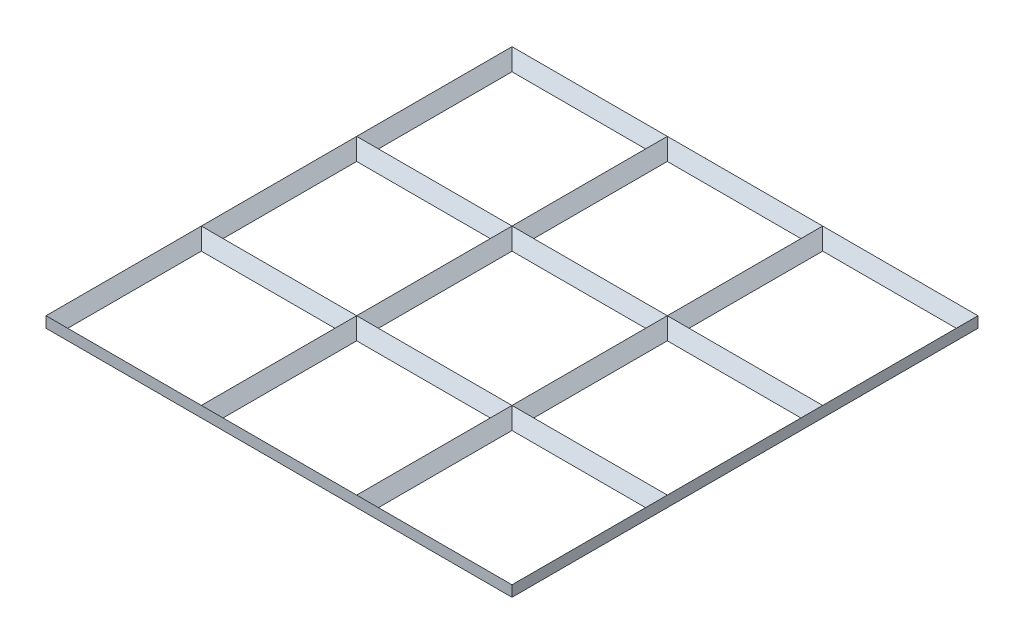
ISO-10303-21;
HEADER;
FILE_DESCRIPTION(('STEP AP214'),'2;1');
FILE_NAME('part.step','',(''),(''),'','','');
FILE_SCHEMA(('AUTOMOTIVE_DESIGN { 1 0 10303 214 1 1 1 1 }'));
ENDSEC;
DATA;
#1=APPLICATION_CONTEXT('core data for automotive mechanical design processes');
#2=APPLICATION_PROTOCOL_DEFINITION('international standard','automotive_design',2000,#1);
#3=PRODUCT_CONTEXT('',#1,'mechanical');
#4=PRODUCT('Part','Part','',(#3));
#5=PRODUCT_RELATED_PRODUCT_CATEGORY('part','',(#4));
#6=PRODUCT_DEFINITION_FORMATION('','',#4);
#7=PRODUCT_DEFINITION_CONTEXT('part definition',#1,'design');
#8=PRODUCT_DEFINITION('design','',#6,#7);
#9=PRODUCT_DEFINITION_SHAPE('','',#8);
#10=(LENGTH_UNIT() NAMED_UNIT(*) SI_UNIT(.MILLI.,.METRE.));
#11=(NAMED_UNIT(*) PLANE_ANGLE_UNIT() SI_UNIT($,.RADIAN.));
#12=(NAMED_UNIT(*) SI_UNIT($,.STERADIAN.) SOLID_ANGLE_UNIT());
#13=UNCERTAINTY_MEASURE_WITH_UNIT(LENGTH_MEASURE(1.E-05),#10,'distance_accuracy_value','');
#14=(GEOMETRIC_REPRESENTATION_CONTEXT(3) GLOBAL_UNCERTAINTY_ASSIGNED_CONTEXT((#13)) GLOBAL_UNIT_ASSIGNED_CONTEXT((#10,
#11,#12)) REPRESENTATION_CONTEXT('',''));
#15=CARTESIAN_POINT('',(0.,0.,0.));
#16=DIRECTION('',(0.,0.,1.));
#17=DIRECTION('',(1.,0.,0.));
#18=AXIS2_PLACEMENT_3D('',#15,#16,#17);
#19=CARTESIAN_POINT('',(0.,3.5,100.));
#20=DIRECTION('',(-1.,0.,0.));
#21=DIRECTION('',(0.,0.,1.));
#22=AXIS2_PLACEMENT_3D('',#19,#20,#21);
#23=PLANE('',#22);
#24=DIRECTION('',(0.,0.,-1.));
#25=VECTOR('',#24,1.);
#26=CARTESIAN_POINT('',(0.,0.,100.));
#27=LINE('',#26,#25);
#28=CARTESIAN_POINT('',(0.,0.,100.));
#29=VERTEX_POINT('',#28);
#30=CARTESIAN_POINT('',(0.,0.,-50.));
#31=VERTEX_POINT('',#30);
#32=EDGE_CURVE('E228',#29,#31,#27,.T.);
#33=ORIENTED_EDGE('',*,*,#32,.F.);
#34=DIRECTION('',(0.,-1.,0.));
#35=VECTOR('',#34,1.);
#36=CARTESIAN_POINT('',(0.,3.5,100.));
#37=LINE('',#36,#35);
#38=CARTESIAN_POINT('',(0.,3.5,100.));
#39=VERTEX_POINT('',#38);
#40=EDGE_CURVE('E11',#39,#29,#37,.T.);
#41=ORIENTED_EDGE('',*,*,#40,.F.);
#42=DIRECTION('',(0.,0.,-1.));
#43=VECTOR('',#42,1.);
#44=CARTESIAN_POINT('',(0.,3.5,100.));
#45=LINE('',#44,#43);
#46=CARTESIAN_POINT('',(0.,3.5,50.));
#47=VERTEX_POINT('',#46);
#48=EDGE_CURVE('E479',#39,#47,#45,.T.);
#49=ORIENTED_EDGE('',*,*,#48,.T.);
#50=DIRECTION('',(0.,0.,-1.));
#51=VECTOR('',#50,1.);
#52=CARTESIAN_POINT('',(0.,3.5,50.));
#53=LINE('',#52,#51);
#54=CARTESIAN_POINT('',(0.,3.5,0.));
#55=VERTEX_POINT('',#54);
#56=EDGE_CURVE('E327',#47,#55,#53,.T.);
#57=ORIENTED_EDGE('',*,*,#56,.T.);
#58=DIRECTION('',(0.,0.,-1.));
#59=VECTOR('',#58,1.);
#60=CARTESIAN_POINT('',(0.,3.5,0.));
#61=LINE('',#60,#59);
#62=CARTESIAN_POINT('',(0.,3.5,-50.));
#63=VERTEX_POINT('',#62);
#64=EDGE_CURVE('E308',#55,#63,#61,.T.);
#65=ORIENTED_EDGE('',*,*,#64,.T.);
#66=DIRECTION('',(0.,-1.,0.));
#67=VECTOR('',#66,1.);
#68=CARTESIAN_POINT('',(0.,3.5,-50.));
#69=LINE('',#68,#67);
#70=EDGE_CURVE('E305',#63,#31,#69,.T.);
#71=ORIENTED_EDGE('',*,*,#70,.T.);
#72=EDGE_LOOP('',(#33,#41,#49,#57,#65,#71));
#73=FACE_BOUND('',#72,.T.);
#74=ADVANCED_FACE('F38',(#73),#23,.T.);
#75=CARTESIAN_POINT('',(0.,3.5,100.));
#76=DIRECTION('',(0.,0.,-1.));
#77=DIRECTION('',(-1.,0.,0.));
#78=AXIS2_PLACEMENT_3D('',#75,#76,#77);
#79=PLANE('',#78);
#80=DIRECTION('',(1.,0.,0.));
#81=VECTOR('',#80,1.);
#82=CARTESIAN_POINT('',(0.,0.,100.));
#83=LINE('',#82,#81);
#84=CARTESIAN_POINT('',(150.,0.,100.));
#85=VERTEX_POINT('',#84);
#86=EDGE_CURVE('E482',#29,#85,#83,.T.);
#87=ORIENTED_EDGE('',*,*,#86,.T.);
#88=DIRECTION('',(0.,-1.,0.));
#89=VECTOR('',#88,1.);
#90=CARTESIAN_POINT('',(150.,3.5,100.));
#91=LINE('',#90,#89);
#92=CARTESIAN_POINT('',(150.,3.5,100.));
#93=VERTEX_POINT('',#92);
#94=EDGE_CURVE('E244',#93,#85,#91,.T.);
#95=ORIENTED_EDGE('',*,*,#94,.F.);
#96=DIRECTION('',(1.,0.,0.));
#97=VECTOR('',#96,1.);
#98=CARTESIAN_POINT('',(100.,3.5,100.));
#99=LINE('',#98,#97);
#100=CARTESIAN_POINT('',(100.,3.5,100.));
#101=VERTEX_POINT('',#100);
#102=EDGE_CURVE('E369',#101,#93,#99,.T.);
#103=ORIENTED_EDGE('',*,*,#102,.F.);
#104=DIRECTION('',(1.,0.,0.));
#105=VECTOR('',#104,1.);
#106=CARTESIAN_POINT('',(50.,3.5,100.));
#107=LINE('',#106,#105);
#108=CARTESIAN_POINT('',(50.,3.5,100.));
#109=VERTEX_POINT('',#108);
#110=EDGE_CURVE('E430',#109,#101,#107,.T.);
#111=ORIENTED_EDGE('',*,*,#110,.F.);
#112=DIRECTION('',(1.,0.,0.));
#113=VECTOR('',#112,1.);
#114=CARTESIAN_POINT('',(0.,3.5,100.));
#115=LINE('',#114,#113);
#116=EDGE_CURVE('E45',#39,#109,#115,.T.);
#117=ORIENTED_EDGE('',*,*,#116,.F.);
#118=ORIENTED_EDGE('',*,*,#40,.T.);
#119=EDGE_LOOP('',(#87,#95,#103,#111,#117,#118));
#120=FACE_BOUND('',#119,.T.);
#121=ADVANCED_FACE('F493',(#120),#79,.F.);
#122=CARTESIAN_POINT('',(0.,0.,100.));
#123=DIRECTION('',(0.,1.,0.));
#124=DIRECTION('',(0.,0.,1.));
#125=AXIS2_PLACEMENT_3D('',#122,#123,#124);
#126=PLANE('',#125);
#127=DIRECTION('',(1.,0.,0.));
#128=VECTOR('',#127,1.);
#129=CARTESIAN_POINT('',(0.,0.,96.5));
#130=LINE('',#129,#128);
#131=CARTESIAN_POINT('',(3.5,0.,96.5));
#132=VERTEX_POINT('',#131);
#133=CARTESIAN_POINT('',(46.5,0.,96.5));
#134=VERTEX_POINT('',#133);
#135=EDGE_CURVE('E473',#132,#134,#130,.T.);
#136=ORIENTED_EDGE('',*,*,#135,.T.);
#137=DIRECTION('',(0.,0.,1.));
#138=VECTOR('',#137,1.);
#139=CARTESIAN_POINT('',(46.5,0.,100.));
#140=LINE('',#139,#138);
#141=CARTESIAN_POINT('',(46.5,0.,53.5));
#142=VERTEX_POINT('',#141);
#143=EDGE_CURVE('E490',#142,#134,#140,.T.);
#144=ORIENTED_EDGE('',*,*,#143,.F.);
#145=DIRECTION('',(1.,0.,0.));
#146=VECTOR('',#145,1.);
#147=CARTESIAN_POINT('',(0.,0.,53.5));
#148=LINE('',#147,#146);
#149=CARTESIAN_POINT('',(3.5,0.,53.5));
#150=VERTEX_POINT('',#149);
#151=EDGE_CURVE('E487',#150,#142,#148,.T.);
#152=ORIENTED_EDGE('',*,*,#151,.F.);
#153=DIRECTION('',(0.,0.,-1.));
#154=VECTOR('',#153,1.);
#155=CARTESIAN_POINT('',(3.5,0.,100.));
#156=LINE('',#155,#154);
#157=EDGE_CURVE('E58',#132,#150,#156,.T.);
#158=ORIENTED_EDGE('',*,*,#157,.F.);
#159=EDGE_LOOP('',(#136,#144,#152,#158));
#160=FACE_BOUND('',#159,.T.);
#161=DIRECTION('',(0.,0.,1.));
#162=VECTOR('',#161,1.);
#163=CARTESIAN_POINT('',(150.,0.,50.));
#164=LINE('',#163,#162);
#165=CARTESIAN_POINT('',(150.,0.,-50.));
#166=VERTEX_POINT('',#165);
#167=EDGE_CURVE('E225',#166,#85,#164,.T.);
#168=ORIENTED_EDGE('',*,*,#167,.T.);
#169=ORIENTED_EDGE('',*,*,#86,.F.);
#170=ORIENTED_EDGE('',*,*,#32,.T.);
#171=DIRECTION('',(1.,0.,0.));
#172=VECTOR('',#171,1.);
#173=CARTESIAN_POINT('',(50.,0.,-50.));
#174=LINE('',#173,#172);
#175=EDGE_CURVE('E221',#31,#166,#174,.T.);
#176=ORIENTED_EDGE('',*,*,#175,.T.);
#177=EDGE_LOOP('',(#168,#169,#170,#176));
#178=FACE_BOUND('',#177,.T.);
#179=DIRECTION('',(1.,0.,0.));
#180=VECTOR('',#179,1.);
#181=CARTESIAN_POINT('',(50.,0.,-3.5));
#182=LINE('',#181,#180);
#183=CARTESIAN_POINT('',(53.5,0.,-3.5));
#184=VERTEX_POINT('',#183);
#185=CARTESIAN_POINT('',(96.5,0.,-3.5));
#186=VERTEX_POINT('',#185);
#187=EDGE_CURVE('E445',#184,#186,#182,.T.);
#188=ORIENTED_EDGE('',*,*,#187,.T.);
#189=DIRECTION('',(0.,0.,1.));
#190=VECTOR('',#189,1.);
#191=CARTESIAN_POINT('',(96.5,0.,0.));
#192=LINE('',#191,#190);
#193=CARTESIAN_POINT('',(96.5,0.,-46.5));
#194=VERTEX_POINT('',#193);
#195=EDGE_CURVE('E234',#194,#186,#192,.T.);
#196=ORIENTED_EDGE('',*,*,#195,.F.);
#197=DIRECTION('',(1.,0.,0.));
#198=VECTOR('',#197,1.);
#199=CARTESIAN_POINT('',(50.,0.,-46.5));
#200=LINE('',#199,#198);
#201=CARTESIAN_POINT('',(53.5,0.,-46.5));
#202=VERTEX_POINT('',#201);
#203=EDGE_CURVE('E466',#202,#194,#200,.T.);
#204=ORIENTED_EDGE('',*,*,#203,.F.);
#205=DIRECTION('',(0.,0.,-1.));
#206=VECTOR('',#205,1.);
#207=CARTESIAN_POINT('',(53.5,0.,0.));
#208=LINE('',#207,#206);
#209=EDGE_CURVE('E464',#184,#202,#208,.T.);
#210=ORIENTED_EDGE('',*,*,#209,.F.);
#211=EDGE_LOOP('',(#188,#196,#204,#210));
#212=FACE_BOUND('',#211,.T.);
#213=DIRECTION('',(1.,0.,0.));
#214=VECTOR('',#213,1.);
#215=CARTESIAN_POINT('',(50.,0.,96.5));
#216=LINE('',#215,#214);
#217=CARTESIAN_POINT('',(53.5,0.,96.5));
#218=VERTEX_POINT('',#217);
#219=CARTESIAN_POINT('',(96.5,0.,96.5));
#220=VERTEX_POINT('',#219);
#221=EDGE_CURVE('E414',#218,#220,#216,.T.);
#222=ORIENTED_EDGE('',*,*,#221,.T.);
#223=DIRECTION('',(0.,0.,1.));
#224=VECTOR('',#223,1.);
#225=CARTESIAN_POINT('',(96.5,0.,100.));
#226=LINE('',#225,#224);
#227=CARTESIAN_POINT('',(96.5,0.,53.5));
#228=VERTEX_POINT('',#227);
#229=EDGE_CURVE('E425',#228,#220,#226,.T.);
#230=ORIENTED_EDGE('',*,*,#229,.F.);
#231=DIRECTION('',(1.,0.,0.));
#232=VECTOR('',#231,1.);
#233=CARTESIAN_POINT('',(50.,0.,53.5));
#234=LINE('',#233,#232);
#235=CARTESIAN_POINT('',(53.5,0.,53.5));
#236=VERTEX_POINT('',#235);
#237=EDGE_CURVE('E438',#236,#228,#234,.T.);
#238=ORIENTED_EDGE('',*,*,#237,.F.);
#239=DIRECTION('',(0.,0.,-1.));
#240=VECTOR('',#239,1.);
#241=CARTESIAN_POINT('',(53.5,0.,100.));
#242=LINE('',#241,#240);
#243=EDGE_CURVE('E436',#218,#236,#242,.T.);
#244=ORIENTED_EDGE('',*,*,#243,.F.);
#245=EDGE_LOOP('',(#222,#230,#238,#244));
#246=FACE_BOUND('',#245,.T.);
#247=DIRECTION('',(1.,0.,0.));
#248=VECTOR('',#247,1.);
#249=CARTESIAN_POINT('',(100.,0.,46.5));
#250=LINE('',#249,#248);
#251=CARTESIAN_POINT('',(103.5,0.,46.5));
#252=VERTEX_POINT('',#251);
#253=CARTESIAN_POINT('',(146.5,0.,46.5));
#254=VERTEX_POINT('',#253);
#255=EDGE_CURVE('E385',#252,#254,#250,.T.);
#256=ORIENTED_EDGE('',*,*,#255,.T.);
#257=DIRECTION('',(0.,0.,1.));
#258=VECTOR('',#257,1.);
#259=CARTESIAN_POINT('',(146.5,0.,50.));
#260=LINE('',#259,#258);
#261=CARTESIAN_POINT('',(146.5,0.,3.5));
#262=VERTEX_POINT('',#261);
#263=EDGE_CURVE('E246',#262,#254,#260,.T.);
#264=ORIENTED_EDGE('',*,*,#263,.F.);
#265=DIRECTION('',(1.,0.,0.));
#266=VECTOR('',#265,1.);
#267=CARTESIAN_POINT('',(100.,0.,3.5));
#268=LINE('',#267,#266);
#269=CARTESIAN_POINT('',(103.5,0.,3.5));
#270=VERTEX_POINT('',#269);
#271=EDGE_CURVE('E407',#270,#262,#268,.T.);
#272=ORIENTED_EDGE('',*,*,#271,.F.);
#273=DIRECTION('',(0.,0.,-1.));
#274=VECTOR('',#273,1.);
#275=CARTESIAN_POINT('',(103.5,0.,50.));
#276=LINE('',#275,#274);
#277=EDGE_CURVE('E405',#252,#270,#276,.T.);
#278=ORIENTED_EDGE('',*,*,#277,.F.);
#279=EDGE_LOOP('',(#256,#264,#272,#278));
#280=FACE_BOUND('',#279,.T.);
#281=DIRECTION('',(1.,0.,0.));
#282=VECTOR('',#281,1.);
#283=CARTESIAN_POINT('',(50.,0.,46.5));
#284=LINE('',#283,#282);
#285=CARTESIAN_POINT('',(53.5,0.,46.5));
#286=VERTEX_POINT('',#285);
#287=CARTESIAN_POINT('',(96.5,0.,46.5));
#288=VERTEX_POINT('',#287);
#289=EDGE_CURVE('E276',#286,#288,#284,.T.);
#290=ORIENTED_EDGE('',*,*,#289,.T.);
#291=DIRECTION('',(0.,0.,1.));
#292=VECTOR('',#291,1.);
#293=CARTESIAN_POINT('',(96.5,0.,50.));
#294=LINE('',#293,#292);
#295=CARTESIAN_POINT('',(96.5,0.,3.5));
#296=VERTEX_POINT('',#295);
#297=EDGE_CURVE('E278',#296,#288,#294,.T.);
#298=ORIENTED_EDGE('',*,*,#297,.F.);
#299=DIRECTION('',(1.,0.,0.));
#300=VECTOR('',#299,1.);
#301=CARTESIAN_POINT('',(50.,0.,3.5));
#302=LINE('',#301,#300);
#303=CARTESIAN_POINT('',(53.5,0.,3.5));
#304=VERTEX_POINT('',#303);
#305=EDGE_CURVE('E283',#304,#296,#302,.T.);
#306=ORIENTED_EDGE('',*,*,#305,.F.);
#307=DIRECTION('',(0.,0.,-1.));
#308=VECTOR('',#307,1.);
#309=CARTESIAN_POINT('',(53.5,0.,50.));
#310=LINE('',#309,#308);
#311=EDGE_CURVE('E287',#286,#304,#310,.T.);
#312=ORIENTED_EDGE('',*,*,#311,.F.);
#313=EDGE_LOOP('',(#290,#298,#306,#312));
#314=FACE_BOUND('',#313,.T.);
#315=DIRECTION('',(1.,0.,0.));
#316=VECTOR('',#315,1.);
#317=CARTESIAN_POINT('',(0.,0.,-3.5));
#318=LINE('',#317,#316);
#319=CARTESIAN_POINT('',(3.5,0.,-3.5));
#320=VERTEX_POINT('',#319);
#321=CARTESIAN_POINT('',(46.5,0.,-3.5));
#322=VERTEX_POINT('',#321);
#323=EDGE_CURVE('E293',#320,#322,#318,.T.);
#324=ORIENTED_EDGE('',*,*,#323,.T.);
#325=DIRECTION('',(0.,0.,1.));
#326=VECTOR('',#325,1.);
#327=CARTESIAN_POINT('',(46.5,0.,0.));
#328=LINE('',#327,#326);
#329=CARTESIAN_POINT('',(46.5,0.,-46.5));
#330=VERTEX_POINT('',#329);
#331=EDGE_CURVE('E309',#330,#322,#328,.T.);
#332=ORIENTED_EDGE('',*,*,#331,.F.);
#333=DIRECTION('',(1.,0.,0.));
#334=VECTOR('',#333,1.);
#335=CARTESIAN_POINT('',(0.,0.,-46.5));
#336=LINE('',#335,#334);
#337=CARTESIAN_POINT('',(3.5,0.,-46.5));
#338=VERTEX_POINT('',#337);
#339=EDGE_CURVE('E314',#338,#330,#336,.T.);
#340=ORIENTED_EDGE('',*,*,#339,.F.);
#341=DIRECTION('',(0.,0.,-1.));
#342=VECTOR('',#341,1.);
#343=CARTESIAN_POINT('',(3.5,0.,0.));
#344=LINE('',#343,#342);
#345=EDGE_CURVE('E307',#320,#338,#344,.T.);
#346=ORIENTED_EDGE('',*,*,#345,.F.);
#347=EDGE_LOOP('',(#324,#332,#340,#346));
#348=FACE_BOUND('',#347,.T.);
#349=DIRECTION('',(1.,0.,0.));
#350=VECTOR('',#349,1.);
#351=CARTESIAN_POINT('',(0.,0.,46.5));
#352=LINE('',#351,#350);
#353=CARTESIAN_POINT('',(3.5,0.,46.5));
#354=VERTEX_POINT('',#353);
#355=CARTESIAN_POINT('',(46.5,0.,46.5));
#356=VERTEX_POINT('',#355);
#357=EDGE_CURVE('E290',#354,#356,#352,.T.);
#358=ORIENTED_EDGE('',*,*,#357,.T.);
#359=DIRECTION('',(0.,0.,1.));
#360=VECTOR('',#359,1.);
#361=CARTESIAN_POINT('',(46.5,0.,50.));
#362=LINE('',#361,#360);
#363=CARTESIAN_POINT('',(46.5,0.,3.5));
#364=VERTEX_POINT('',#363);
#365=EDGE_CURVE('E298',#364,#356,#362,.T.);
#366=ORIENTED_EDGE('',*,*,#365,.F.);
#367=DIRECTION('',(1.,0.,0.));
#368=VECTOR('',#367,1.);
#369=CARTESIAN_POINT('',(0.,0.,3.5));
#370=LINE('',#369,#368);
#371=CARTESIAN_POINT('',(3.5,0.,3.5));
#372=VERTEX_POINT('',#371);
#373=EDGE_CURVE('E339',#372,#364,#370,.T.);
#374=ORIENTED_EDGE('',*,*,#373,.F.);
#375=DIRECTION('',(0.,0.,-1.));
#376=VECTOR('',#375,1.);
#377=CARTESIAN_POINT('',(3.5,0.,50.));
#378=LINE('',#377,#376);
#379=EDGE_CURVE('E334',#354,#372,#378,.T.);
#380=ORIENTED_EDGE('',*,*,#379,.F.);
#381=EDGE_LOOP('',(#358,#366,#374,#380));
#382=FACE_BOUND('',#381,.T.);
#383=DIRECTION('',(1.,0.,0.));
#384=VECTOR('',#383,1.);
#385=CARTESIAN_POINT('',(100.,0.,-3.5));
#386=LINE('',#385,#384);
#387=CARTESIAN_POINT('',(103.5,0.,-3.5));
#388=VERTEX_POINT('',#387);
#389=CARTESIAN_POINT('',(146.5,0.,-3.5));
#390=VERTEX_POINT('',#389);
#391=EDGE_CURVE('E252',#388,#390,#386,.T.);
#392=ORIENTED_EDGE('',*,*,#391,.T.);
#393=DIRECTION('',(0.,0.,1.));
#394=VECTOR('',#393,1.);
#395=CARTESIAN_POINT('',(146.5,0.,0.));
#396=LINE('',#395,#394);
#397=CARTESIAN_POINT('',(146.5,0.,-46.5));
#398=VERTEX_POINT('',#397);
#399=EDGE_CURVE('E260',#398,#390,#396,.T.);
#400=ORIENTED_EDGE('',*,*,#399,.F.);
#401=DIRECTION('',(1.,0.,0.));
#402=VECTOR('',#401,1.);
#403=CARTESIAN_POINT('',(100.,0.,-46.5));
#404=LINE('',#403,#402);
#405=CARTESIAN_POINT('',(103.5,0.,-46.5));
#406=VERTEX_POINT('',#405);
#407=EDGE_CURVE('E265',#406,#398,#404,.T.);
#408=ORIENTED_EDGE('',*,*,#407,.F.);
#409=DIRECTION('',(0.,0.,-1.));
#410=VECTOR('',#409,1.);
#411=CARTESIAN_POINT('',(103.5,0.,0.));
#412=LINE('',#411,#410);
#413=EDGE_CURVE('E255',#388,#406,#412,.T.);
#414=ORIENTED_EDGE('',*,*,#413,.F.);
#415=EDGE_LOOP('',(#392,#400,#408,#414));
#416=FACE_BOUND('',#415,.T.);
#417=DIRECTION('',(1.,0.,0.));
#418=VECTOR('',#417,1.);
#419=CARTESIAN_POINT('',(100.,0.,96.5));
#420=LINE('',#419,#418);
#421=CARTESIAN_POINT('',(103.5,0.,96.5));
#422=VERTEX_POINT('',#421);
#423=CARTESIAN_POINT('',(146.5,0.,96.5));
#424=VERTEX_POINT('',#423);
#425=EDGE_CURVE('E360',#422,#424,#420,.T.);
#426=ORIENTED_EDGE('',*,*,#425,.T.);
#427=DIRECTION('',(0.,0.,1.));
#428=VECTOR('',#427,1.);
#429=CARTESIAN_POINT('',(146.5,0.,100.));
#430=LINE('',#429,#428);
#431=CARTESIAN_POINT('',(146.5,0.,53.5));
#432=VERTEX_POINT('',#431);
#433=EDGE_CURVE('E370',#432,#424,#430,.T.);
#434=ORIENTED_EDGE('',*,*,#433,.F.);
#435=DIRECTION('',(1.,0.,0.));
#436=VECTOR('',#435,1.);
#437=CARTESIAN_POINT('',(100.,0.,53.5));
#438=LINE('',#437,#436);
#439=CARTESIAN_POINT('',(103.5,0.,53.5));
#440=VERTEX_POINT('',#439);
#441=EDGE_CURVE('E376',#440,#432,#438,.T.);
#442=ORIENTED_EDGE('',*,*,#441,.F.);
#443=DIRECTION('',(0.,0.,-1.));
#444=VECTOR('',#443,1.);
#445=CARTESIAN_POINT('',(103.5,0.,100.));
#446=LINE('',#445,#444);
#447=EDGE_CURVE('E374',#422,#440,#446,.T.);
#448=ORIENTED_EDGE('',*,*,#447,.F.);
#449=EDGE_LOOP('',(#426,#434,#442,#448));
#450=FACE_BOUND('',#449,.T.);
#451=ADVANCED_FACE('F223',(#160,#178,#212,#246,#280,#314,#348,#382,#416,#450),#126,.F.);
#452=CARTESIAN_POINT('',(3.5,0.,100.));
#453=DIRECTION('',(-0.707106781186546,-0.707106781186549,0.));
#454=DIRECTION('',(0.707106781186549,-0.707106781186546,0.));
#455=AXIS2_PLACEMENT_3D('',#452,#453,#454);
#456=PLANE('',#455);
#457=ORIENTED_EDGE('',*,*,#157,.T.);
#458=DIRECTION('',(0.577350269189627,-0.577350269189624,0.577350269189627));
#459=VECTOR('',#458,1.);
#460=CARTESIAN_POINT('',(19.,-15.5,69.));
#461=LINE('',#460,#459);
#462=EDGE_CURVE('E461',#47,#150,#461,.T.);
#463=ORIENTED_EDGE('',*,*,#462,.F.);
#464=ORIENTED_EDGE('',*,*,#48,.F.);
#465=DIRECTION('',(-0.577350269189627,0.577350269189624,0.577350269189627));
#466=VECTOR('',#465,1.);
#467=CARTESIAN_POINT('',(2.33333333333333,1.16666666666667,97.6666666666667));
#468=LINE('',#467,#466);
#469=EDGE_CURVE('E471',#39,#132,#468,.F.);
#470=ORIENTED_EDGE('',*,*,#469,.T.);
#471=EDGE_LOOP('',(#457,#463,#464,#470));
#472=FACE_BOUND('',#471,.T.);
#473=ADVANCED_FACE('F604',(#472),#456,.F.);
#474=CARTESIAN_POINT('',(0.,0.,96.5));
#475=DIRECTION('',(0.,-0.707106781186549,0.707106781186546));
#476=DIRECTION('',(0.,-0.707106781186546,-0.707106781186549));
#477=AXIS2_PLACEMENT_3D('',#474,#475,#476);
#478=PLANE('',#477);
#479=ORIENTED_EDGE('',*,*,#135,.F.);
#480=ORIENTED_EDGE('',*,*,#469,.F.);
#481=ORIENTED_EDGE('',*,*,#116,.T.);
#482=DIRECTION('',(0.577350269189627,0.577350269189624,0.577350269189627));
#483=VECTOR('',#482,1.);
#484=CARTESIAN_POINT('',(31.,-15.5,81.));
#485=LINE('',#484,#483);
#486=EDGE_CURVE('E474',#109,#134,#485,.F.);
#487=ORIENTED_EDGE('',*,*,#486,.T.);
#488=EDGE_LOOP('',(#479,#480,#481,#487));
#489=FACE_BOUND('',#488,.T.);
#490=ADVANCED_FACE('F611',(#489),#478,.F.);
#491=CARTESIAN_POINT('',(46.5,0.,100.));
#492=DIRECTION('',(0.707106781186546,-0.707106781186549,0.));
#493=DIRECTION('',(0.707106781186549,0.707106781186546,0.));
#494=AXIS2_PLACEMENT_3D('',#491,#492,#493);
#495=PLANE('',#494);
#496=ORIENTED_EDGE('',*,*,#143,.T.);
#497=ORIENTED_EDGE('',*,*,#486,.F.);
#498=DIRECTION('',(0.,0.,-1.));
#499=VECTOR('',#498,1.);
#500=CARTESIAN_POINT('',(50.,3.5,100.));
#501=LINE('',#500,#499);
#502=CARTESIAN_POINT('',(50.,3.5,50.));
#503=VERTEX_POINT('',#502);
#504=EDGE_CURVE('E427',#109,#503,#501,.T.);
#505=ORIENTED_EDGE('',*,*,#504,.T.);
#506=DIRECTION('',(-0.577350269189626,-0.577350269189624,0.577350269189627));
#507=VECTOR('',#506,1.);
#508=CARTESIAN_POINT('',(31.,-15.5,69.));
#509=LINE('',#508,#507);
#510=EDGE_CURVE('E476',#503,#142,#509,.T.);
#511=ORIENTED_EDGE('',*,*,#510,.T.);
#512=EDGE_LOOP('',(#496,#497,#505,#511));
#513=FACE_BOUND('',#512,.T.);
#514=ADVANCED_FACE('F669',(#513),#495,.F.);
#515=CARTESIAN_POINT('',(0.,0.,53.5));
#516=DIRECTION('',(0.,-0.707106781186549,-0.707106781186546));
#517=DIRECTION('',(0.,0.707106781186546,-0.707106781186549));
#518=AXIS2_PLACEMENT_3D('',#515,#516,#517);
#519=PLANE('',#518);
#520=ORIENTED_EDGE('',*,*,#151,.T.);
#521=ORIENTED_EDGE('',*,*,#510,.F.);
#522=DIRECTION('',(1.,0.,0.));
#523=VECTOR('',#522,1.);
#524=CARTESIAN_POINT('',(0.,3.5,50.));
#525=LINE('',#524,#523);
#526=EDGE_CURVE('E347',#47,#503,#525,.T.);
#527=ORIENTED_EDGE('',*,*,#526,.F.);
#528=ORIENTED_EDGE('',*,*,#462,.T.);
#529=EDGE_LOOP('',(#520,#521,#527,#528));
#530=FACE_BOUND('',#529,.T.);
#531=ADVANCED_FACE('F679',(#530),#519,.F.);
#532=CARTESIAN_POINT('',(50.,3.5,-50.));
#533=DIRECTION('',(0.,0.,-1.));
#534=DIRECTION('',(-1.,0.,0.));
#535=AXIS2_PLACEMENT_3D('',#532,#533,#534);
#536=PLANE('',#535);
#537=ORIENTED_EDGE('',*,*,#175,.F.);
#538=ORIENTED_EDGE('',*,*,#70,.F.);
#539=DIRECTION('',(1.,0.,0.));
#540=VECTOR('',#539,1.);
#541=CARTESIAN_POINT('',(0.,3.5,-50.));
#542=LINE('',#541,#540);
#543=CARTESIAN_POINT('',(50.,3.5,-50.));
#544=VERTEX_POINT('',#543);
#545=EDGE_CURVE('E303',#63,#544,#542,.T.);
#546=ORIENTED_EDGE('',*,*,#545,.T.);
#547=DIRECTION('',(1.,0.,0.));
#548=VECTOR('',#547,1.);
#549=CARTESIAN_POINT('',(50.,3.5,-50.));
#550=LINE('',#549,#548);
#551=CARTESIAN_POINT('',(100.,3.5,-50.));
#552=VERTEX_POINT('',#551);
#553=EDGE_CURVE('E454',#544,#552,#550,.T.);
#554=ORIENTED_EDGE('',*,*,#553,.T.);
#555=DIRECTION('',(1.,0.,0.));
#556=VECTOR('',#555,1.);
#557=CARTESIAN_POINT('',(100.,3.5,-50.));
#558=LINE('',#557,#556);
#559=CARTESIAN_POINT('',(150.,3.5,-50.));
#560=VERTEX_POINT('',#559);
#561=EDGE_CURVE('E251',#552,#560,#558,.T.);
#562=ORIENTED_EDGE('',*,*,#561,.T.);
#563=DIRECTION('',(0.,-1.,0.));
#564=VECTOR('',#563,1.);
#565=CARTESIAN_POINT('',(150.,3.5,-50.));
#566=LINE('',#565,#564);
#567=EDGE_CURVE('E240',#560,#166,#566,.T.);
#568=ORIENTED_EDGE('',*,*,#567,.T.);
#569=EDGE_LOOP('',(#537,#538,#546,#554,#562,#568));
#570=FACE_BOUND('',#569,.T.);
#571=ADVANCED_FACE('F248',(#570),#536,.T.);
#572=CARTESIAN_POINT('',(53.5,0.,0.));
#573=DIRECTION('',(-0.707106781186546,-0.707106781186549,0.));
#574=DIRECTION('',(0.707106781186549,-0.707106781186546,0.));
#575=AXIS2_PLACEMENT_3D('',#572,#573,#574);
#576=PLANE('',#575);
#577=ORIENTED_EDGE('',*,*,#209,.T.);
#578=DIRECTION('',(0.577350269189627,-0.577350269189624,0.577350269189627));
#579=VECTOR('',#578,1.);
#580=CARTESIAN_POINT('',(69.,-15.5,-31.));
#581=LINE('',#580,#579);
#582=EDGE_CURVE('E433',#544,#202,#581,.T.);
#583=ORIENTED_EDGE('',*,*,#582,.F.);
#584=DIRECTION('',(0.,0.,-1.));
#585=VECTOR('',#584,1.);
#586=CARTESIAN_POINT('',(50.,3.5,0.));
#587=LINE('',#586,#585);
#588=CARTESIAN_POINT('',(50.,3.5,0.));
#589=VERTEX_POINT('',#588);
#590=EDGE_CURVE('E456',#589,#544,#587,.T.);
#591=ORIENTED_EDGE('',*,*,#590,.F.);
#592=DIRECTION('',(-0.577350269189627,0.577350269189624,0.577350269189627));
#593=VECTOR('',#592,1.);
#594=CARTESIAN_POINT('',(52.3333333333333,1.16666666666667,-2.33333333333333));
#595=LINE('',#594,#593);
#596=EDGE_CURVE('E443',#589,#184,#595,.F.);
#597=ORIENTED_EDGE('',*,*,#596,.T.);
#598=EDGE_LOOP('',(#577,#583,#591,#597));
#599=FACE_BOUND('',#598,.T.);
#600=ADVANCED_FACE('F511',(#599),#576,.F.);
#601=CARTESIAN_POINT('',(50.,0.,-3.5));
#602=DIRECTION('',(0.,-0.707106781186549,0.707106781186546));
#603=DIRECTION('',(0.,-0.707106781186546,-0.707106781186549));
#604=AXIS2_PLACEMENT_3D('',#601,#602,#603);
#605=PLANE('',#604);
#606=ORIENTED_EDGE('',*,*,#187,.F.);
#607=ORIENTED_EDGE('',*,*,#596,.F.);
#608=DIRECTION('',(1.,0.,0.));
#609=VECTOR('',#608,1.);
#610=CARTESIAN_POINT('',(50.,3.5,0.));
#611=LINE('',#610,#609);
#612=CARTESIAN_POINT('',(100.,3.5,0.));
#613=VERTEX_POINT('',#612);
#614=EDGE_CURVE('E459',#589,#613,#611,.T.);
#615=ORIENTED_EDGE('',*,*,#614,.T.);
#616=DIRECTION('',(0.577350269189627,0.577350269189624,0.577350269189627));
#617=VECTOR('',#616,1.);
#618=CARTESIAN_POINT('',(81.,-15.5,-19.));
#619=LINE('',#618,#617);
#620=EDGE_CURVE('E446',#613,#186,#619,.F.);
#621=ORIENTED_EDGE('',*,*,#620,.T.);
#622=EDGE_LOOP('',(#606,#607,#615,#621));
#623=FACE_BOUND('',#622,.T.);
#624=ADVANCED_FACE('F712',(#623),#605,.F.);
#625=CARTESIAN_POINT('',(96.5,0.,0.));
#626=DIRECTION('',(0.707106781186546,-0.707106781186549,0.));
#627=DIRECTION('',(0.707106781186549,0.707106781186546,0.));
#628=AXIS2_PLACEMENT_3D('',#625,#626,#627);
#629=PLANE('',#628);
#630=ORIENTED_EDGE('',*,*,#195,.T.);
#631=ORIENTED_EDGE('',*,*,#620,.F.);
#632=DIRECTION('',(0.,0.,1.));
#633=VECTOR('',#632,1.);
#634=CARTESIAN_POINT('',(100.,3.5,0.));
#635=LINE('',#634,#633);
#636=EDGE_CURVE('E233',#552,#613,#635,.T.);
#637=ORIENTED_EDGE('',*,*,#636,.F.);
#638=DIRECTION('',(-0.577350269189626,-0.577350269189624,0.577350269189627));
#639=VECTOR('',#638,1.);
#640=CARTESIAN_POINT('',(81.,-15.5,-31.));
#641=LINE('',#640,#639);
#642=EDGE_CURVE('E449',#552,#194,#641,.T.);
#643=ORIENTED_EDGE('',*,*,#642,.T.);
#644=EDGE_LOOP('',(#630,#631,#637,#643));
#645=FACE_BOUND('',#644,.T.);
#646=ADVANCED_FACE('F721',(#645),#629,.F.);
#647=CARTESIAN_POINT('',(50.,0.,-46.5));
#648=DIRECTION('',(0.,-0.707106781186549,-0.707106781186546));
#649=DIRECTION('',(0.,0.707106781186546,-0.707106781186549));
#650=AXIS2_PLACEMENT_3D('',#647,#648,#649);
#651=PLANE('',#650);
#652=ORIENTED_EDGE('',*,*,#203,.T.);
#653=ORIENTED_EDGE('',*,*,#642,.F.);
#654=ORIENTED_EDGE('',*,*,#553,.F.);
#655=ORIENTED_EDGE('',*,*,#582,.T.);
#656=EDGE_LOOP('',(#652,#653,#654,#655));
#657=FACE_BOUND('',#656,.T.);
#658=ADVANCED_FACE('F730',(#657),#651,.F.);
#659=CARTESIAN_POINT('',(53.5,0.,100.));
#660=DIRECTION('',(-0.707106781186546,-0.707106781186549,0.));
#661=DIRECTION('',(0.707106781186549,-0.707106781186546,0.));
#662=AXIS2_PLACEMENT_3D('',#659,#660,#661);
#663=PLANE('',#662);
#664=ORIENTED_EDGE('',*,*,#243,.T.);
#665=DIRECTION('',(0.577350269189627,-0.577350269189624,0.577350269189627));
#666=VECTOR('',#665,1.);
#667=CARTESIAN_POINT('',(69.,-15.5,69.));
#668=LINE('',#667,#666);
#669=EDGE_CURVE('E402',#503,#236,#668,.T.);
#670=ORIENTED_EDGE('',*,*,#669,.F.);
#671=ORIENTED_EDGE('',*,*,#504,.F.);
#672=DIRECTION('',(-0.577350269189627,0.577350269189624,0.577350269189627));
#673=VECTOR('',#672,1.);
#674=CARTESIAN_POINT('',(52.3333333333333,1.16666666666667,97.6666666666667));
#675=LINE('',#674,#673);
#676=EDGE_CURVE('E412',#109,#218,#675,.F.);
#677=ORIENTED_EDGE('',*,*,#676,.T.);
#678=EDGE_LOOP('',(#664,#670,#671,#677));
#679=FACE_BOUND('',#678,.T.);
#680=ADVANCED_FACE('F551',(#679),#663,.F.);
#681=CARTESIAN_POINT('',(50.,0.,96.5));
#682=DIRECTION('',(0.,-0.707106781186549,0.707106781186546));
#683=DIRECTION('',(0.,-0.707106781186546,-0.707106781186549));
#684=AXIS2_PLACEMENT_3D('',#681,#682,#683);
#685=PLANE('',#684);
#686=ORIENTED_EDGE('',*,*,#221,.F.);
#687=ORIENTED_EDGE('',*,*,#676,.F.);
#688=ORIENTED_EDGE('',*,*,#110,.T.);
#689=DIRECTION('',(0.577350269189627,0.577350269189624,0.577350269189627));
#690=VECTOR('',#689,1.);
#691=CARTESIAN_POINT('',(81.,-15.5,81.));
#692=LINE('',#691,#690);
#693=EDGE_CURVE('E415',#101,#220,#692,.F.);
#694=ORIENTED_EDGE('',*,*,#693,.T.);
#695=EDGE_LOOP('',(#686,#687,#688,#694));
#696=FACE_BOUND('',#695,.T.);
#697=ADVANCED_FACE('F593',(#696),#685,.F.);
#698=CARTESIAN_POINT('',(96.5,0.,100.));
#699=DIRECTION('',(0.707106781186546,-0.707106781186549,0.));
#700=DIRECTION('',(0.707106781186549,0.707106781186546,0.));
#701=AXIS2_PLACEMENT_3D('',#698,#699,#700);
#702=PLANE('',#701);
#703=ORIENTED_EDGE('',*,*,#229,.T.);
#704=ORIENTED_EDGE('',*,*,#693,.F.);
#705=DIRECTION('',(0.,0.,1.));
#706=VECTOR('',#705,1.);
#707=CARTESIAN_POINT('',(100.,3.5,100.));
#708=LINE('',#707,#706);
#709=CARTESIAN_POINT('',(100.,3.5,50.));
#710=VERTEX_POINT('',#709);
#711=EDGE_CURVE('E421',#710,#101,#708,.T.);
#712=ORIENTED_EDGE('',*,*,#711,.F.);
#713=DIRECTION('',(-0.577350269189626,-0.577350269189624,0.577350269189627));
#714=VECTOR('',#713,1.);
#715=CARTESIAN_POINT('',(81.,-15.5,69.));
#716=LINE('',#715,#714);
#717=EDGE_CURVE('E418',#710,#228,#716,.T.);
#718=ORIENTED_EDGE('',*,*,#717,.T.);
#719=EDGE_LOOP('',(#703,#704,#712,#718));
#720=FACE_BOUND('',#719,.T.);
#721=ADVANCED_FACE('F589',(#720),#702,.F.);
#722=CARTESIAN_POINT('',(50.,0.,53.5));
#723=DIRECTION('',(0.,-0.707106781186549,-0.707106781186546));
#724=DIRECTION('',(0.,0.707106781186546,-0.707106781186549));
#725=AXIS2_PLACEMENT_3D('',#722,#723,#724);
#726=PLANE('',#725);
#727=ORIENTED_EDGE('',*,*,#237,.T.);
#728=ORIENTED_EDGE('',*,*,#717,.F.);
#729=DIRECTION('',(1.,0.,0.));
#730=VECTOR('',#729,1.);
#731=CARTESIAN_POINT('',(50.,3.5,50.));
#732=LINE('',#731,#730);
#733=EDGE_CURVE('E424',#503,#710,#732,.T.);
#734=ORIENTED_EDGE('',*,*,#733,.F.);
#735=ORIENTED_EDGE('',*,*,#669,.T.);
#736=EDGE_LOOP('',(#727,#728,#734,#735));
#737=FACE_BOUND('',#736,.T.);
#738=ADVANCED_FACE('F557',(#737),#726,.F.);
#739=CARTESIAN_POINT('',(150.,3.5,50.));
#740=DIRECTION('',(1.,0.,0.));
#741=DIRECTION('',(0.,0.,-1.));
#742=AXIS2_PLACEMENT_3D('',#739,#740,#741);
#743=PLANE('',#742);
#744=ORIENTED_EDGE('',*,*,#167,.F.);
#745=ORIENTED_EDGE('',*,*,#567,.F.);
#746=DIRECTION('',(0.,0.,1.));
#747=VECTOR('',#746,1.);
#748=CARTESIAN_POINT('',(150.,3.5,0.));
#749=LINE('',#748,#747);
#750=CARTESIAN_POINT('',(150.,3.5,0.));
#751=VERTEX_POINT('',#750);
#752=EDGE_CURVE('E257',#560,#751,#749,.T.);
#753=ORIENTED_EDGE('',*,*,#752,.T.);
#754=DIRECTION('',(0.,0.,1.));
#755=VECTOR('',#754,1.);
#756=CARTESIAN_POINT('',(150.,3.5,50.));
#757=LINE('',#756,#755);
#758=CARTESIAN_POINT('',(150.,3.5,50.));
#759=VERTEX_POINT('',#758);
#760=EDGE_CURVE('E245',#751,#759,#757,.T.);
#761=ORIENTED_EDGE('',*,*,#760,.T.);
#762=DIRECTION('',(0.,0.,1.));
#763=VECTOR('',#762,1.);
#764=CARTESIAN_POINT('',(150.,3.5,100.));
#765=LINE('',#764,#763);
#766=EDGE_CURVE('E367',#759,#93,#765,.T.);
#767=ORIENTED_EDGE('',*,*,#766,.T.);
#768=ORIENTED_EDGE('',*,*,#94,.T.);
#769=EDGE_LOOP('',(#744,#745,#753,#761,#767,#768));
#770=FACE_BOUND('',#769,.T.);
#771=ADVANCED_FACE('F238',(#770),#743,.T.);
#772=CARTESIAN_POINT('',(103.5,0.,50.));
#773=DIRECTION('',(-0.707106781186546,-0.707106781186549,0.));
#774=DIRECTION('',(0.707106781186549,-0.707106781186546,0.));
#775=AXIS2_PLACEMENT_3D('',#772,#773,#774);
#776=PLANE('',#775);
#777=ORIENTED_EDGE('',*,*,#277,.T.);
#778=DIRECTION('',(0.577350269189627,-0.577350269189624,0.577350269189627));
#779=VECTOR('',#778,1.);
#780=CARTESIAN_POINT('',(119.,-15.5,19.));
#781=LINE('',#780,#779);
#782=EDGE_CURVE('E382',#613,#270,#781,.T.);
#783=ORIENTED_EDGE('',*,*,#782,.F.);
#784=DIRECTION('',(0.,0.,-1.));
#785=VECTOR('',#784,1.);
#786=CARTESIAN_POINT('',(100.,3.5,50.));
#787=LINE('',#786,#785);
#788=EDGE_CURVE('E396',#710,#613,#787,.T.);
#789=ORIENTED_EDGE('',*,*,#788,.F.);
#790=DIRECTION('',(-0.577350269189627,0.577350269189624,0.577350269189627));
#791=VECTOR('',#790,1.);
#792=CARTESIAN_POINT('',(102.333333333333,1.16666666666667,47.6666666666667));
#793=LINE('',#792,#791);
#794=EDGE_CURVE('E383',#710,#252,#793,.F.);
#795=ORIENTED_EDGE('',*,*,#794,.T.);
#796=EDGE_LOOP('',(#777,#783,#789,#795));
#797=FACE_BOUND('',#796,.T.);
#798=ADVANCED_FACE('F585',(#797),#776,.F.);
#799=CARTESIAN_POINT('',(100.,0.,46.5));
#800=DIRECTION('',(0.,-0.707106781186549,0.707106781186546));
#801=DIRECTION('',(0.,-0.707106781186546,-0.707106781186549));
#802=AXIS2_PLACEMENT_3D('',#799,#800,#801);
#803=PLANE('',#802);
#804=ORIENTED_EDGE('',*,*,#255,.F.);
#805=ORIENTED_EDGE('',*,*,#794,.F.);
#806=DIRECTION('',(1.,0.,0.));
#807=VECTOR('',#806,1.);
#808=CARTESIAN_POINT('',(100.,3.5,50.));
#809=LINE('',#808,#807);
#810=EDGE_CURVE('E399',#710,#759,#809,.T.);
#811=ORIENTED_EDGE('',*,*,#810,.T.);
#812=DIRECTION('',(0.577350269189627,0.577350269189624,0.577350269189627));
#813=VECTOR('',#812,1.);
#814=CARTESIAN_POINT('',(131.,-15.5,31.));
#815=LINE('',#814,#813);
#816=EDGE_CURVE('E386',#759,#254,#815,.F.);
#817=ORIENTED_EDGE('',*,*,#816,.T.);
#818=EDGE_LOOP('',(#804,#805,#811,#817));
#819=FACE_BOUND('',#818,.T.);
#820=ADVANCED_FACE('F581',(#819),#803,.F.);
#821=CARTESIAN_POINT('',(146.5,0.,50.));
#822=DIRECTION('',(0.707106781186546,-0.707106781186549,0.));
#823=DIRECTION('',(0.707106781186549,0.707106781186546,0.));
#824=AXIS2_PLACEMENT_3D('',#821,#822,#823);
#825=PLANE('',#824);
#826=ORIENTED_EDGE('',*,*,#263,.T.);
#827=ORIENTED_EDGE('',*,*,#816,.F.);
#828=ORIENTED_EDGE('',*,*,#760,.F.);
#829=DIRECTION('',(-0.577350269189626,-0.577350269189624,0.577350269189627));
#830=VECTOR('',#829,1.);
#831=CARTESIAN_POINT('',(131.,-15.5,19.));
#832=LINE('',#831,#830);
#833=EDGE_CURVE('E389',#751,#262,#832,.T.);
#834=ORIENTED_EDGE('',*,*,#833,.T.);
#835=EDGE_LOOP('',(#826,#827,#828,#834));
#836=FACE_BOUND('',#835,.T.);
#837=ADVANCED_FACE('F803',(#836),#825,.F.);
#838=CARTESIAN_POINT('',(100.,0.,3.5));
#839=DIRECTION('',(0.,-0.707106781186549,-0.707106781186546));
#840=DIRECTION('',(0.,0.707106781186546,-0.707106781186549));
#841=AXIS2_PLACEMENT_3D('',#838,#839,#840);
#842=PLANE('',#841);
#843=ORIENTED_EDGE('',*,*,#271,.T.);
#844=ORIENTED_EDGE('',*,*,#833,.F.);
#845=DIRECTION('',(1.,0.,0.));
#846=VECTOR('',#845,1.);
#847=CARTESIAN_POINT('',(100.,3.5,0.));
#848=LINE('',#847,#846);
#849=EDGE_CURVE('E394',#613,#751,#848,.T.);
#850=ORIENTED_EDGE('',*,*,#849,.F.);
#851=ORIENTED_EDGE('',*,*,#782,.T.);
#852=EDGE_LOOP('',(#843,#844,#850,#851));
#853=FACE_BOUND('',#852,.T.);
#854=ADVANCED_FACE('F812',(#853),#842,.F.);
#855=CARTESIAN_POINT('',(103.5,0.,100.));
#856=DIRECTION('',(-0.707106781186546,-0.707106781186549,0.));
#857=DIRECTION('',(0.707106781186549,-0.707106781186546,0.));
#858=AXIS2_PLACEMENT_3D('',#855,#856,#857);
#859=PLANE('',#858);
#860=ORIENTED_EDGE('',*,*,#447,.T.);
#861=DIRECTION('',(0.577350269189627,-0.577350269189624,0.577350269189627));
#862=VECTOR('',#861,1.);
#863=CARTESIAN_POINT('',(119.,-15.5,69.));
#864=LINE('',#863,#862);
#865=EDGE_CURVE('E356',#710,#440,#864,.T.);
#866=ORIENTED_EDGE('',*,*,#865,.F.);
#867=ORIENTED_EDGE('',*,*,#711,.T.);
#868=DIRECTION('',(-0.577350269189627,0.577350269189624,0.577350269189627));
#869=VECTOR('',#868,1.);
#870=CARTESIAN_POINT('',(102.333333333333,1.16666666666667,97.6666666666667));
#871=LINE('',#870,#869);
#872=EDGE_CURVE('E358',#101,#422,#871,.F.);
#873=ORIENTED_EDGE('',*,*,#872,.T.);
#874=EDGE_LOOP('',(#860,#866,#867,#873));
#875=FACE_BOUND('',#874,.T.);
#876=ADVANCED_FACE('F570',(#875),#859,.F.);
#877=CARTESIAN_POINT('',(100.,0.,96.5));
#878=DIRECTION('',(0.,-0.707106781186549,0.707106781186546));
#879=DIRECTION('',(0.,-0.707106781186546,-0.707106781186549));
#880=AXIS2_PLACEMENT_3D('',#877,#878,#879);
#881=PLANE('',#880);
#882=ORIENTED_EDGE('',*,*,#425,.F.);
#883=ORIENTED_EDGE('',*,*,#872,.F.);
#884=ORIENTED_EDGE('',*,*,#102,.T.);
#885=DIRECTION('',(0.577350269189627,0.577350269189624,0.577350269189627));
#886=VECTOR('',#885,1.);
#887=CARTESIAN_POINT('',(131.,-15.5,81.));
#888=LINE('',#887,#886);
#889=EDGE_CURVE('E361',#93,#424,#888,.F.);
#890=ORIENTED_EDGE('',*,*,#889,.T.);
#891=EDGE_LOOP('',(#882,#883,#884,#890));
#892=FACE_BOUND('',#891,.T.);
#893=ADVANCED_FACE('F598',(#892),#881,.F.);
#894=CARTESIAN_POINT('',(146.5,0.,100.));
#895=DIRECTION('',(0.707106781186546,-0.707106781186549,0.));
#896=DIRECTION('',(0.707106781186549,0.707106781186546,0.));
#897=AXIS2_PLACEMENT_3D('',#894,#895,#896);
#898=PLANE('',#897);
#899=ORIENTED_EDGE('',*,*,#433,.T.);
#900=ORIENTED_EDGE('',*,*,#889,.F.);
#901=ORIENTED_EDGE('',*,*,#766,.F.);
#902=DIRECTION('',(-0.577350269189626,-0.577350269189624,0.577350269189627));
#903=VECTOR('',#902,1.);
#904=CARTESIAN_POINT('',(131.,-15.5,69.));
#905=LINE('',#904,#903);
#906=EDGE_CURVE('E364',#759,#432,#905,.T.);
#907=ORIENTED_EDGE('',*,*,#906,.T.);
#908=EDGE_LOOP('',(#899,#900,#901,#907));
#909=FACE_BOUND('',#908,.T.);
#910=ADVANCED_FACE('F600',(#909),#898,.F.);
#911=CARTESIAN_POINT('',(100.,0.,53.5));
#912=DIRECTION('',(0.,-0.707106781186549,-0.707106781186546));
#913=DIRECTION('',(0.,0.707106781186546,-0.707106781186549));
#914=AXIS2_PLACEMENT_3D('',#911,#912,#913);
#915=PLANE('',#914);
#916=ORIENTED_EDGE('',*,*,#441,.T.);
#917=ORIENTED_EDGE('',*,*,#906,.F.);
#918=ORIENTED_EDGE('',*,*,#810,.F.);
#919=ORIENTED_EDGE('',*,*,#865,.T.);
#920=EDGE_LOOP('',(#916,#917,#918,#919));
#921=FACE_BOUND('',#920,.T.);
#922=ADVANCED_FACE('F577',(#921),#915,.F.);
#923=CARTESIAN_POINT('',(53.5,0.,50.));
#924=DIRECTION('',(-0.707106781186546,-0.707106781186549,0.));
#925=DIRECTION('',(0.707106781186549,-0.707106781186546,0.));
#926=AXIS2_PLACEMENT_3D('',#923,#924,#925);
#927=PLANE('',#926);
#928=ORIENTED_EDGE('',*,*,#311,.T.);
#929=DIRECTION('',(0.577350269189627,-0.577350269189624,0.577350269189627));
#930=VECTOR('',#929,1.);
#931=CARTESIAN_POINT('',(69.,-15.5,19.));
#932=LINE('',#931,#930);
#933=EDGE_CURVE('E286',#589,#304,#932,.T.);
#934=ORIENTED_EDGE('',*,*,#933,.F.);
#935=DIRECTION('',(0.,0.,-1.));
#936=VECTOR('',#935,1.);
#937=CARTESIAN_POINT('',(50.,3.5,50.));
#938=LINE('',#937,#936);
#939=EDGE_CURVE('E294',#503,#589,#938,.T.);
#940=ORIENTED_EDGE('',*,*,#939,.F.);
#941=DIRECTION('',(-0.577350269189627,0.577350269189624,0.577350269189627));
#942=VECTOR('',#941,1.);
#943=CARTESIAN_POINT('',(52.3333333333333,1.16666666666667,47.6666666666667));
#944=LINE('',#943,#942);
#945=EDGE_CURVE('E289',#503,#286,#944,.F.);
#946=ORIENTED_EDGE('',*,*,#945,.T.);
#947=EDGE_LOOP('',(#928,#934,#940,#946));
#948=FACE_BOUND('',#947,.T.);
#949=ADVANCED_FACE('F516',(#948),#927,.F.);
#950=CARTESIAN_POINT('',(50.,0.,46.5));
#951=DIRECTION('',(0.,-0.707106781186549,0.707106781186546));
#952=DIRECTION('',(0.,-0.707106781186546,-0.707106781186549));
#953=AXIS2_PLACEMENT_3D('',#950,#951,#952);
#954=PLANE('',#953);
#955=ORIENTED_EDGE('',*,*,#289,.F.);
#956=ORIENTED_EDGE('',*,*,#945,.F.);
#957=ORIENTED_EDGE('',*,*,#733,.T.);
#958=DIRECTION('',(0.577350269189627,0.577350269189624,0.577350269189627));
#959=VECTOR('',#958,1.);
#960=CARTESIAN_POINT('',(81.,-15.5,31.));
#961=LINE('',#960,#959);
#962=EDGE_CURVE('E282',#710,#288,#961,.F.);
#963=ORIENTED_EDGE('',*,*,#962,.T.);
#964=EDGE_LOOP('',(#955,#956,#957,#963));
#965=FACE_BOUND('',#964,.T.);
#966=ADVANCED_FACE('F562',(#965),#954,.F.);
#967=CARTESIAN_POINT('',(96.5,0.,50.));
#968=DIRECTION('',(0.707106781186546,-0.707106781186549,0.));
#969=DIRECTION('',(0.707106781186549,0.707106781186546,0.));
#970=AXIS2_PLACEMENT_3D('',#967,#968,#969);
#971=PLANE('',#970);
#972=ORIENTED_EDGE('',*,*,#297,.T.);
#973=ORIENTED_EDGE('',*,*,#962,.F.);
#974=ORIENTED_EDGE('',*,*,#788,.T.);
#975=DIRECTION('',(-0.577350269189626,-0.577350269189624,0.577350269189627));
#976=VECTOR('',#975,1.);
#977=CARTESIAN_POINT('',(81.,-15.5,19.));
#978=LINE('',#977,#976);
#979=EDGE_CURVE('E281',#613,#296,#978,.T.);
#980=ORIENTED_EDGE('',*,*,#979,.T.);
#981=EDGE_LOOP('',(#972,#973,#974,#980));
#982=FACE_BOUND('',#981,.T.);
#983=ADVANCED_FACE('F565',(#982),#971,.F.);
#984=CARTESIAN_POINT('',(50.,0.,3.5));
#985=DIRECTION('',(0.,-0.707106781186549,-0.707106781186546));
#986=DIRECTION('',(0.,0.707106781186546,-0.707106781186549));
#987=AXIS2_PLACEMENT_3D('',#984,#985,#986);
#988=PLANE('',#987);
#989=ORIENTED_EDGE('',*,*,#305,.T.);
#990=ORIENTED_EDGE('',*,*,#979,.F.);
#991=ORIENTED_EDGE('',*,*,#614,.F.);
#992=ORIENTED_EDGE('',*,*,#933,.T.);
#993=EDGE_LOOP('',(#989,#990,#991,#992));
#994=FACE_BOUND('',#993,.T.);
#995=ADVANCED_FACE('F521',(#994),#988,.F.);
#996=CARTESIAN_POINT('',(3.5,0.,0.));
#997=DIRECTION('',(-0.707106781186546,-0.707106781186549,0.));
#998=DIRECTION('',(0.707106781186549,-0.707106781186546,0.));
#999=AXIS2_PLACEMENT_3D('',#996,#997,#998);
#1000=PLANE('',#999);
#1001=ORIENTED_EDGE('',*,*,#345,.T.);
#1002=DIRECTION('',(0.577350269189627,-0.577350269189624,0.577350269189627));
#1003=VECTOR('',#1002,1.);
#1004=CARTESIAN_POINT('',(19.,-15.5,-31.));
#1005=LINE('',#1004,#1003);
#1006=EDGE_CURVE('E317',#63,#338,#1005,.T.);
#1007=ORIENTED_EDGE('',*,*,#1006,.F.);
#1008=ORIENTED_EDGE('',*,*,#64,.F.);
#1009=DIRECTION('',(-0.577350269189627,0.577350269189624,0.577350269189627));
#1010=VECTOR('',#1009,1.);
#1011=CARTESIAN_POINT('',(2.33333333333333,1.16666666666667,-2.33333333333333));
#1012=LINE('',#1011,#1010);
#1013=EDGE_CURVE('E319',#55,#320,#1012,.F.);
#1014=ORIENTED_EDGE('',*,*,#1013,.T.);
#1015=EDGE_LOOP('',(#1001,#1007,#1008,#1014));
#1016=FACE_BOUND('',#1015,.T.);
#1017=ADVANCED_FACE('F887',(#1016),#1000,.F.);
#1018=CARTESIAN_POINT('',(0.,0.,-3.5));
#1019=DIRECTION('',(0.,-0.707106781186549,0.707106781186546));
#1020=DIRECTION('',(0.,-0.707106781186546,-0.707106781186549));
#1021=AXIS2_PLACEMENT_3D('',#1018,#1019,#1020);
#1022=PLANE('',#1021);
#1023=ORIENTED_EDGE('',*,*,#323,.F.);
#1024=ORIENTED_EDGE('',*,*,#1013,.F.);
#1025=DIRECTION('',(1.,0.,0.));
#1026=VECTOR('',#1025,1.);
#1027=CARTESIAN_POINT('',(0.,3.5,0.));
#1028=LINE('',#1027,#1026);
#1029=EDGE_CURVE('E322',#55,#589,#1028,.T.);
#1030=ORIENTED_EDGE('',*,*,#1029,.T.);
#1031=DIRECTION('',(0.577350269189627,0.577350269189624,0.577350269189627));
#1032=VECTOR('',#1031,1.);
#1033=CARTESIAN_POINT('',(31.,-15.5,-19.));
#1034=LINE('',#1033,#1032);
#1035=EDGE_CURVE('E313',#589,#322,#1034,.F.);
#1036=ORIENTED_EDGE('',*,*,#1035,.T.);
#1037=EDGE_LOOP('',(#1023,#1024,#1030,#1036));
#1038=FACE_BOUND('',#1037,.T.);
#1039=ADVANCED_FACE('F527',(#1038),#1022,.F.);
#1040=CARTESIAN_POINT('',(46.5,0.,0.));
#1041=DIRECTION('',(0.707106781186546,-0.707106781186549,0.));
#1042=DIRECTION('',(0.707106781186549,0.707106781186546,0.));
#1043=AXIS2_PLACEMENT_3D('',#1040,#1041,#1042);
#1044=PLANE('',#1043);
#1045=ORIENTED_EDGE('',*,*,#331,.T.);
#1046=ORIENTED_EDGE('',*,*,#1035,.F.);
#1047=ORIENTED_EDGE('',*,*,#590,.T.);
#1048=DIRECTION('',(-0.577350269189626,-0.577350269189624,0.577350269189627));
#1049=VECTOR('',#1048,1.);
#1050=CARTESIAN_POINT('',(31.,-15.5,-31.));
#1051=LINE('',#1050,#1049);
#1052=EDGE_CURVE('E312',#544,#330,#1051,.T.);
#1053=ORIENTED_EDGE('',*,*,#1052,.T.);
#1054=EDGE_LOOP('',(#1045,#1046,#1047,#1053));
#1055=FACE_BOUND('',#1054,.T.);
#1056=ADVANCED_FACE('F506',(#1055),#1044,.F.);
#1057=CARTESIAN_POINT('',(0.,0.,-46.5));
#1058=DIRECTION('',(0.,-0.707106781186549,-0.707106781186546));
#1059=DIRECTION('',(0.,0.707106781186546,-0.707106781186549));
#1060=AXIS2_PLACEMENT_3D('',#1057,#1058,#1059);
#1061=PLANE('',#1060);
#1062=ORIENTED_EDGE('',*,*,#339,.T.);
#1063=ORIENTED_EDGE('',*,*,#1052,.F.);
#1064=ORIENTED_EDGE('',*,*,#545,.F.);
#1065=ORIENTED_EDGE('',*,*,#1006,.T.);
#1066=EDGE_LOOP('',(#1062,#1063,#1064,#1065));
#1067=FACE_BOUND('',#1066,.T.);
#1068=ADVANCED_FACE('F502',(#1067),#1061,.F.);
#1069=CARTESIAN_POINT('',(3.5,0.,50.));
#1070=DIRECTION('',(-0.707106781186546,-0.707106781186549,0.));
#1071=DIRECTION('',(0.707106781186549,-0.707106781186546,0.));
#1072=AXIS2_PLACEMENT_3D('',#1069,#1070,#1071);
#1073=PLANE('',#1072);
#1074=ORIENTED_EDGE('',*,*,#379,.T.);
#1075=DIRECTION('',(0.577350269189627,-0.577350269189624,0.577350269189627));
#1076=VECTOR('',#1075,1.);
#1077=CARTESIAN_POINT('',(19.,-15.5,19.));
#1078=LINE('',#1077,#1076);
#1079=EDGE_CURVE('E342',#55,#372,#1078,.T.);
#1080=ORIENTED_EDGE('',*,*,#1079,.F.);
#1081=ORIENTED_EDGE('',*,*,#56,.F.);
#1082=DIRECTION('',(-0.577350269189627,0.577350269189624,0.577350269189627));
#1083=VECTOR('',#1082,1.);
#1084=CARTESIAN_POINT('',(2.33333333333333,1.16666666666667,47.6666666666667));
#1085=LINE('',#1084,#1083);
#1086=EDGE_CURVE('E344',#47,#354,#1085,.F.);
#1087=ORIENTED_EDGE('',*,*,#1086,.T.);
#1088=EDGE_LOOP('',(#1074,#1080,#1081,#1087));
#1089=FACE_BOUND('',#1088,.T.);
#1090=ADVANCED_FACE('F537',(#1089),#1073,.F.);
#1091=CARTESIAN_POINT('',(0.,0.,46.5));
#1092=DIRECTION('',(0.,-0.707106781186549,0.707106781186546));
#1093=DIRECTION('',(0.,-0.707106781186546,-0.707106781186549));
#1094=AXIS2_PLACEMENT_3D('',#1091,#1092,#1093);
#1095=PLANE('',#1094);
#1096=ORIENTED_EDGE('',*,*,#357,.F.);
#1097=ORIENTED_EDGE('',*,*,#1086,.F.);
#1098=ORIENTED_EDGE('',*,*,#526,.T.);
#1099=DIRECTION('',(0.577350269189627,0.577350269189624,0.577350269189627));
#1100=VECTOR('',#1099,1.);
#1101=CARTESIAN_POINT('',(31.,-15.5,31.));
#1102=LINE('',#1101,#1100);
#1103=EDGE_CURVE('E338',#503,#356,#1102,.F.);
#1104=ORIENTED_EDGE('',*,*,#1103,.T.);
#1105=EDGE_LOOP('',(#1096,#1097,#1098,#1104));
#1106=FACE_BOUND('',#1105,.T.);
#1107=ADVANCED_FACE('F929',(#1106),#1095,.F.);
#1108=CARTESIAN_POINT('',(46.5,0.,50.));
#1109=DIRECTION('',(0.707106781186546,-0.707106781186549,0.));
#1110=DIRECTION('',(0.707106781186549,0.707106781186546,0.));
#1111=AXIS2_PLACEMENT_3D('',#1108,#1109,#1110);
#1112=PLANE('',#1111);
#1113=ORIENTED_EDGE('',*,*,#365,.T.);
#1114=ORIENTED_EDGE('',*,*,#1103,.F.);
#1115=ORIENTED_EDGE('',*,*,#939,.T.);
#1116=DIRECTION('',(-0.577350269189626,-0.577350269189624,0.577350269189627));
#1117=VECTOR('',#1116,1.);
#1118=CARTESIAN_POINT('',(31.,-15.5,19.));
#1119=LINE('',#1118,#1117);
#1120=EDGE_CURVE('E297',#589,#364,#1119,.T.);
#1121=ORIENTED_EDGE('',*,*,#1120,.T.);
#1122=EDGE_LOOP('',(#1113,#1114,#1115,#1121));
#1123=FACE_BOUND('',#1122,.T.);
#1124=ADVANCED_FACE('F545',(#1123),#1112,.F.);
#1125=CARTESIAN_POINT('',(0.,0.,3.5));
#1126=DIRECTION('',(0.,-0.707106781186549,-0.707106781186546));
#1127=DIRECTION('',(0.,0.707106781186546,-0.707106781186549));
#1128=AXIS2_PLACEMENT_3D('',#1125,#1126,#1127);
#1129=PLANE('',#1128);
#1130=ORIENTED_EDGE('',*,*,#373,.T.);
#1131=ORIENTED_EDGE('',*,*,#1120,.F.);
#1132=ORIENTED_EDGE('',*,*,#1029,.F.);
#1133=ORIENTED_EDGE('',*,*,#1079,.T.);
#1134=EDGE_LOOP('',(#1130,#1131,#1132,#1133));
#1135=FACE_BOUND('',#1134,.T.);
#1136=ADVANCED_FACE('F530',(#1135),#1129,.F.);
#1137=CARTESIAN_POINT('',(103.5,0.,0.));
#1138=DIRECTION('',(-0.707106781186546,-0.707106781186549,0.));
#1139=DIRECTION('',(0.707106781186549,-0.707106781186546,0.));
#1140=AXIS2_PLACEMENT_3D('',#1137,#1138,#1139);
#1141=PLANE('',#1140);
#1142=ORIENTED_EDGE('',*,*,#413,.T.);
#1143=DIRECTION('',(0.577350269189627,-0.577350269189624,0.577350269189627));
#1144=VECTOR('',#1143,1.);
#1145=CARTESIAN_POINT('',(119.,-15.5,-31.));
#1146=LINE('',#1145,#1144);
#1147=EDGE_CURVE('E268',#552,#406,#1146,.T.);
#1148=ORIENTED_EDGE('',*,*,#1147,.F.);
#1149=ORIENTED_EDGE('',*,*,#636,.T.);
#1150=DIRECTION('',(-0.577350269189627,0.577350269189624,0.577350269189627));
#1151=VECTOR('',#1150,1.);
#1152=CARTESIAN_POINT('',(102.333333333333,1.16666666666667,-2.33333333333333));
#1153=LINE('',#1152,#1151);
#1154=EDGE_CURVE('E269',#613,#388,#1153,.F.);
#1155=ORIENTED_EDGE('',*,*,#1154,.T.);
#1156=EDGE_LOOP('',(#1142,#1148,#1149,#1155));
#1157=FACE_BOUND('',#1156,.T.);
#1158=ADVANCED_FACE('F954',(#1157),#1141,.F.);
#1159=CARTESIAN_POINT('',(100.,0.,-3.5));
#1160=DIRECTION('',(0.,-0.707106781186549,0.707106781186546));
#1161=DIRECTION('',(0.,-0.707106781186546,-0.707106781186549));
#1162=AXIS2_PLACEMENT_3D('',#1159,#1160,#1161);
#1163=PLANE('',#1162);
#1164=ORIENTED_EDGE('',*,*,#391,.F.);
#1165=ORIENTED_EDGE('',*,*,#1154,.F.);
#1166=ORIENTED_EDGE('',*,*,#849,.T.);
#1167=DIRECTION('',(0.577350269189627,0.577350269189624,0.577350269189627));
#1168=VECTOR('',#1167,1.);
#1169=CARTESIAN_POINT('',(131.,-15.5,-19.));
#1170=LINE('',#1169,#1168);
#1171=EDGE_CURVE('E264',#751,#390,#1170,.F.);
#1172=ORIENTED_EDGE('',*,*,#1171,.T.);
#1173=EDGE_LOOP('',(#1164,#1165,#1166,#1172));
#1174=FACE_BOUND('',#1173,.T.);
#1175=ADVANCED_FACE('F963',(#1174),#1163,.F.);
#1176=CARTESIAN_POINT('',(146.5,0.,0.));
#1177=DIRECTION('',(0.707106781186546,-0.707106781186549,0.));
#1178=DIRECTION('',(0.707106781186549,0.707106781186546,0.));
#1179=AXIS2_PLACEMENT_3D('',#1176,#1177,#1178);
#1180=PLANE('',#1179);
#1181=ORIENTED_EDGE('',*,*,#399,.T.);
#1182=ORIENTED_EDGE('',*,*,#1171,.F.);
#1183=ORIENTED_EDGE('',*,*,#752,.F.);
#1184=DIRECTION('',(-0.577350269189626,-0.577350269189624,0.577350269189627));
#1185=VECTOR('',#1184,1.);
#1186=CARTESIAN_POINT('',(131.,-15.5,-31.));
#1187=LINE('',#1186,#1185);
#1188=EDGE_CURVE('E263',#560,#398,#1187,.T.);
#1189=ORIENTED_EDGE('',*,*,#1188,.T.);
#1190=EDGE_LOOP('',(#1181,#1182,#1183,#1189));
#1191=FACE_BOUND('',#1190,.T.);
#1192=ADVANCED_FACE('F973',(#1191),#1180,.F.);
#1193=CARTESIAN_POINT('',(100.,0.,-46.5));
#1194=DIRECTION('',(0.,-0.707106781186549,-0.707106781186546));
#1195=DIRECTION('',(0.,0.707106781186546,-0.707106781186549));
#1196=AXIS2_PLACEMENT_3D('',#1193,#1194,#1195);
#1197=PLANE('',#1196);
#1198=ORIENTED_EDGE('',*,*,#407,.T.);
#1199=ORIENTED_EDGE('',*,*,#1188,.F.);
#1200=ORIENTED_EDGE('',*,*,#561,.F.);
#1201=ORIENTED_EDGE('',*,*,#1147,.T.);
#1202=EDGE_LOOP('',(#1198,#1199,#1200,#1201));
#1203=FACE_BOUND('',#1202,.T.);
#1204=ADVANCED_FACE('F983',(#1203),#1197,.F.);
#1205=CLOSED_SHELL('',(#74,#121,#451,#473,#490,#514,#531,#571,#600,#624,#646,#658,#680,#697,
#721,#738,#771,#798,#820,#837,#854,#876,#893,#910,#922,#949,#966,#983,#995,#1017,#1039,#1056,
#1068,#1090,#1107,#1124,#1136,#1158,#1175,#1192,#1204));
#1206=MANIFOLD_SOLID_BREP('B2',#1205);
#1207=ADVANCED_BREP_SHAPE_REPRESENTATION('',(#18,#1206),#14);
#1208=SHAPE_DEFINITION_REPRESENTATION(#9,#1207);
ENDSEC;
END-ISO-10303-21;
